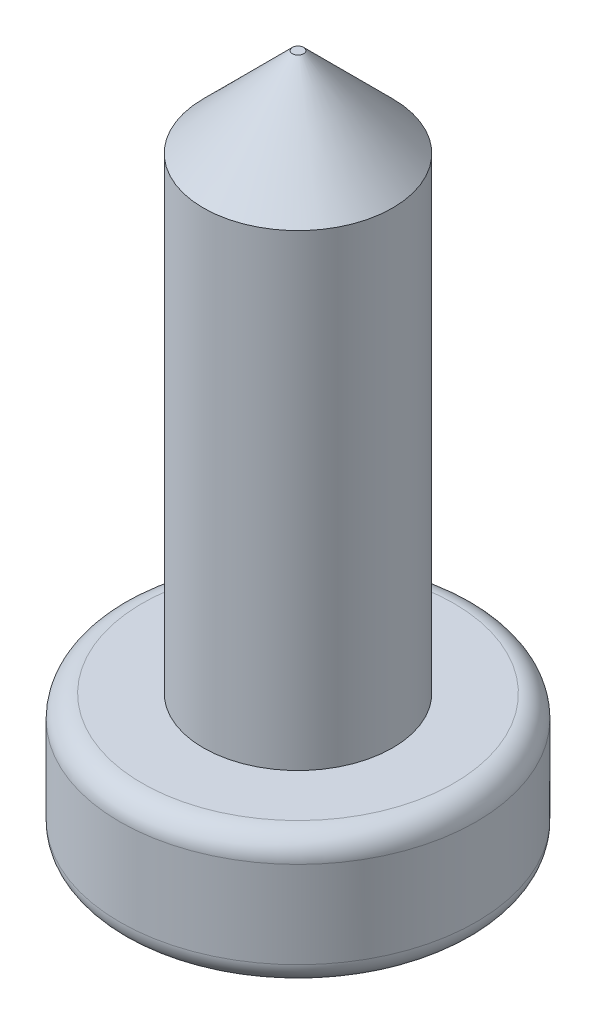
ISO-10303-21;
HEADER;
FILE_DESCRIPTION(('STEP AP214'),'2;1');
FILE_NAME('part.step','',(''),(''),'','','');
FILE_SCHEMA(('AUTOMOTIVE_DESIGN { 1 0 10303 214 1 1 1 1 }'));
ENDSEC;
DATA;
#1=APPLICATION_CONTEXT('core data for automotive mechanical design processes');
#2=APPLICATION_PROTOCOL_DEFINITION('international standard','automotive_design',2000,#1);
#3=PRODUCT_CONTEXT('',#1,'mechanical');
#4=PRODUCT('Part','Part','',(#3));
#5=PRODUCT_RELATED_PRODUCT_CATEGORY('part','',(#4));
#6=PRODUCT_DEFINITION_FORMATION('','',#4);
#7=PRODUCT_DEFINITION_CONTEXT('part definition',#1,'design');
#8=PRODUCT_DEFINITION('design','',#6,#7);
#9=PRODUCT_DEFINITION_SHAPE('','',#8);
#10=(LENGTH_UNIT() NAMED_UNIT(*) SI_UNIT(.MILLI.,.METRE.));
#11=(NAMED_UNIT(*) PLANE_ANGLE_UNIT() SI_UNIT($,.RADIAN.));
#12=(NAMED_UNIT(*) SI_UNIT($,.STERADIAN.) SOLID_ANGLE_UNIT());
#13=UNCERTAINTY_MEASURE_WITH_UNIT(LENGTH_MEASURE(1.E-05),#10,'distance_accuracy_value','');
#14=(GEOMETRIC_REPRESENTATION_CONTEXT(3) GLOBAL_UNCERTAINTY_ASSIGNED_CONTEXT((#13)) GLOBAL_UNIT_ASSIGNED_CONTEXT((#10,
#11,#12)) REPRESENTATION_CONTEXT('',''));
#15=CARTESIAN_POINT('',(0.,0.,0.));
#16=DIRECTION('',(0.,0.,1.));
#17=DIRECTION('',(1.,0.,0.));
#18=AXIS2_PLACEMENT_3D('',#15,#16,#17);
#19=CARTESIAN_POINT('',(0.,6.18,0.));
#20=DIRECTION('',(0.,-1.,0.));
#21=DIRECTION('',(0.,0.,-1.));
#22=AXIS2_PLACEMENT_3D('',#19,#20,#21);
#23=PLANE('',#22);
#24=CARTESIAN_POINT('',(0.,6.18,0.));
#25=DIRECTION('',(0.,-1.,0.));
#26=DIRECTION('',(0.,0.,-1.));
#27=AXIS2_PLACEMENT_3D('',#24,#25,#26);
#28=CIRCLE('',#27,0.0500000000000007);
#29=CARTESIAN_POINT('',(0.,6.18,-0.0500000000000002));
#30=VERTEX_POINT('',#29);
#31=EDGE_CURVE('E183',#30,#30,#28,.F.);
#32=ORIENTED_EDGE('',*,*,#31,.T.);
#33=EDGE_LOOP('',(#32));
#34=FACE_BOUND('',#33,.T.);
#35=ADVANCED_FACE('F35',(#34),#23,.F.);
#36=CARTESIAN_POINT('',(0.,6.18,0.));
#37=DIRECTION('',(0.,1.,0.));
#38=DIRECTION('',(0.,0.,1.));
#39=AXIS2_PLACEMENT_3D('',#36,#37,#38);
#40=CYLINDRICAL_SURFACE('',#39,0.85);
#41=CARTESIAN_POINT('',(0.,5.38,0.));
#42=DIRECTION('',(0.,-1.,0.));
#43=DIRECTION('',(0.,0.,-1.));
#44=AXIS2_PLACEMENT_3D('',#41,#42,#43);
#45=CIRCLE('',#44,0.85);
#46=CARTESIAN_POINT('',(0.,5.38,-0.85));
#47=VERTEX_POINT('',#46);
#48=EDGE_CURVE('E186',#47,#47,#45,.T.);
#49=ORIENTED_EDGE('',*,*,#48,.T.);
#50=EDGE_LOOP('',(#49));
#51=FACE_BOUND('',#50,.T.);
#52=CARTESIAN_POINT('',(0.,1.18,0.));
#53=DIRECTION('',(0.,1.,0.));
#54=DIRECTION('',(0.,0.,1.));
#55=AXIS2_PLACEMENT_3D('',#52,#53,#54);
#56=CIRCLE('',#55,0.850000000000001);
#57=CARTESIAN_POINT('',(0.,1.18,0.850000000000001));
#58=VERTEX_POINT('',#57);
#59=EDGE_CURVE('E180',#58,#58,#56,.T.);
#60=ORIENTED_EDGE('',*,*,#59,.T.);
#61=EDGE_LOOP('',(#60));
#62=FACE_BOUND('',#61,.T.);
#63=ADVANCED_FACE('F209',(#51,#62),#40,.T.);
#64=CARTESIAN_POINT('',(1.6,1.18,0.));
#65=DIRECTION('',(0.,-1.,0.));
#66=DIRECTION('',(0.,0.,-1.));
#67=AXIS2_PLACEMENT_3D('',#64,#65,#66);
#68=PLANE('',#67);
#69=CARTESIAN_POINT('',(0.,1.18,0.));
#70=DIRECTION('',(0.,-1.,0.));
#71=DIRECTION('',(0.,0.,-1.));
#72=AXIS2_PLACEMENT_3D('',#69,#70,#71);
#73=CIRCLE('',#72,1.4);
#74=CARTESIAN_POINT('',(0.,1.18,-1.4));
#75=VERTEX_POINT('',#74);
#76=EDGE_CURVE('E189',#75,#75,#73,.F.);
#77=ORIENTED_EDGE('',*,*,#76,.T.);
#78=EDGE_LOOP('',(#77));
#79=FACE_BOUND('',#78,.T.);
#80=ORIENTED_EDGE('',*,*,#59,.F.);
#81=EDGE_LOOP('',(#80));
#82=FACE_BOUND('',#81,.T.);
#83=ADVANCED_FACE('F206',(#79,#82),#68,.F.);
#84=CARTESIAN_POINT('',(0.,6.18,0.));
#85=DIRECTION('',(0.,1.,0.));
#86=DIRECTION('',(0.,0.,1.));
#87=AXIS2_PLACEMENT_3D('',#84,#85,#86);
#88=CYLINDRICAL_SURFACE('',#87,1.6);
#89=CARTESIAN_POINT('',(0.,0.98,0.));
#90=DIRECTION('',(0.,-1.,0.));
#91=DIRECTION('',(0.,0.,-1.));
#92=AXIS2_PLACEMENT_3D('',#89,#90,#91);
#93=CIRCLE('',#92,1.6);
#94=CARTESIAN_POINT('',(0.,0.98,-1.6));
#95=VERTEX_POINT('',#94);
#96=EDGE_CURVE('E43',#95,#95,#93,.T.);
#97=ORIENTED_EDGE('',*,*,#96,.T.);
#98=EDGE_LOOP('',(#97));
#99=FACE_BOUND('',#98,.T.);
#100=CARTESIAN_POINT('',(0.,0.2,0.));
#101=DIRECTION('',(0.,1.,0.));
#102=DIRECTION('',(0.,0.,1.));
#103=AXIS2_PLACEMENT_3D('',#100,#101,#102);
#104=CIRCLE('',#103,1.6);
#105=CARTESIAN_POINT('',(0.,0.2,1.6));
#106=VERTEX_POINT('',#105);
#107=EDGE_CURVE('E192',#106,#106,#104,.T.);
#108=ORIENTED_EDGE('',*,*,#107,.T.);
#109=EDGE_LOOP('',(#108));
#110=FACE_BOUND('',#109,.T.);
#111=ADVANCED_FACE('F197',(#99,#110),#88,.T.);
#112=CARTESIAN_POINT('',(0.,0.,0.));
#113=DIRECTION('',(0.,1.,0.));
#114=DIRECTION('',(0.,0.,1.));
#115=AXIS2_PLACEMENT_3D('',#112,#113,#114);
#116=PLANE('',#115);
#117=DIRECTION('',(1.,0.,0.));
#118=VECTOR('',#117,1.);
#119=CARTESIAN_POINT('',(0.25,0.,-0.249999999999999));
#120=LINE('',#119,#118);
#121=CARTESIAN_POINT('',(0.25,0.,-0.249999999999999));
#122=VERTEX_POINT('',#121);
#123=CARTESIAN_POINT('',(1.,0.,-0.249999999999995));
#124=VERTEX_POINT('',#123);
#125=EDGE_CURVE('E114',#122,#124,#120,.T.);
#126=ORIENTED_EDGE('',*,*,#125,.F.);
#127=DIRECTION('',(0.,0.,1.));
#128=VECTOR('',#127,1.);
#129=CARTESIAN_POINT('',(0.25,0.,-0.249999999999999));
#130=LINE('',#129,#128);
#131=CARTESIAN_POINT('',(0.25,0.,-1.));
#132=VERTEX_POINT('',#131);
#133=EDGE_CURVE('E50',#132,#122,#130,.T.);
#134=ORIENTED_EDGE('',*,*,#133,.F.);
#135=DIRECTION('',(1.,0.,0.));
#136=VECTOR('',#135,1.);
#137=CARTESIAN_POINT('',(-0.25,0.,-1.));
#138=LINE('',#137,#136);
#139=CARTESIAN_POINT('',(-0.25,0.,-1.));
#140=VERTEX_POINT('',#139);
#141=EDGE_CURVE('E148',#140,#132,#138,.T.);
#142=ORIENTED_EDGE('',*,*,#141,.F.);
#143=DIRECTION('',(0.,0.,-1.));
#144=VECTOR('',#143,1.);
#145=CARTESIAN_POINT('',(-0.25,0.,-0.250000000000002));
#146=LINE('',#145,#144);
#147=CARTESIAN_POINT('',(-0.25,0.,-0.250000000000002));
#148=VERTEX_POINT('',#147);
#149=EDGE_CURVE('E145',#148,#140,#146,.T.);
#150=ORIENTED_EDGE('',*,*,#149,.F.);
#151=DIRECTION('',(1.,0.,0.));
#152=VECTOR('',#151,1.);
#153=CARTESIAN_POINT('',(-0.999999999999996,0.,-0.250000000000006));
#154=LINE('',#153,#152);
#155=CARTESIAN_POINT('',(-0.999999999999996,0.,-0.250000000000006));
#156=VERTEX_POINT('',#155);
#157=EDGE_CURVE('E142',#156,#148,#154,.T.);
#158=ORIENTED_EDGE('',*,*,#157,.F.);
#159=DIRECTION('',(0.,0.,-1.));
#160=VECTOR('',#159,1.);
#161=CARTESIAN_POINT('',(-0.999999999999996,0.,-0.250000000000006));
#162=LINE('',#161,#160);
#163=CARTESIAN_POINT('',(-1.,0.,0.249999999999994));
#164=VERTEX_POINT('',#163);
#165=EDGE_CURVE('E139',#164,#156,#162,.T.);
#166=ORIENTED_EDGE('',*,*,#165,.F.);
#167=DIRECTION('',(-1.,0.,0.));
#168=VECTOR('',#167,1.);
#169=CARTESIAN_POINT('',(-1.,0.,0.249999999999994));
#170=LINE('',#169,#168);
#171=CARTESIAN_POINT('',(-0.250000000000001,0.,0.249999999999998));
#172=VERTEX_POINT('',#171);
#173=EDGE_CURVE('E136',#172,#164,#170,.T.);
#174=ORIENTED_EDGE('',*,*,#173,.F.);
#175=DIRECTION('',(0.,0.,-1.));
#176=VECTOR('',#175,1.);
#177=CARTESIAN_POINT('',(-0.25,0.,1.));
#178=LINE('',#177,#176);
#179=CARTESIAN_POINT('',(-0.25,0.,1.));
#180=VERTEX_POINT('',#179);
#181=EDGE_CURVE('E133',#180,#172,#178,.T.);
#182=ORIENTED_EDGE('',*,*,#181,.F.);
#183=DIRECTION('',(-1.,0.,0.));
#184=VECTOR('',#183,1.);
#185=CARTESIAN_POINT('',(-0.25,0.,1.));
#186=LINE('',#185,#184);
#187=CARTESIAN_POINT('',(0.25,0.,1.));
#188=VERTEX_POINT('',#187);
#189=EDGE_CURVE('E130',#188,#180,#186,.T.);
#190=ORIENTED_EDGE('',*,*,#189,.F.);
#191=DIRECTION('',(0.,0.,1.));
#192=VECTOR('',#191,1.);
#193=CARTESIAN_POINT('',(0.25,0.,1.));
#194=LINE('',#193,#192);
#195=CARTESIAN_POINT('',(0.25,0.,0.250000000000001));
#196=VERTEX_POINT('',#195);
#197=EDGE_CURVE('E124',#196,#188,#194,.T.);
#198=ORIENTED_EDGE('',*,*,#197,.F.);
#199=DIRECTION('',(-1.,0.,0.));
#200=VECTOR('',#199,1.);
#201=CARTESIAN_POINT('',(0.25,0.,0.250000000000001));
#202=LINE('',#201,#200);
#203=CARTESIAN_POINT('',(1.,0.,0.250000000000006));
#204=VERTEX_POINT('',#203);
#205=EDGE_CURVE('E122',#204,#196,#202,.T.);
#206=ORIENTED_EDGE('',*,*,#205,.F.);
#207=DIRECTION('',(0.,0.,1.));
#208=VECTOR('',#207,1.);
#209=CARTESIAN_POINT('',(1.,0.,-0.249999999999995));
#210=LINE('',#209,#208);
#211=EDGE_CURVE('E108',#124,#204,#210,.T.);
#212=ORIENTED_EDGE('',*,*,#211,.F.);
#213=EDGE_LOOP('',(#126,#134,#142,#150,#158,#166,#174,#182,#190,#198,#206,#212));
#214=FACE_BOUND('',#213,.T.);
#215=CARTESIAN_POINT('',(0.,0.,0.));
#216=DIRECTION('',(0.,1.,0.));
#217=DIRECTION('',(0.,0.,1.));
#218=AXIS2_PLACEMENT_3D('',#215,#216,#217);
#219=CIRCLE('',#218,1.4);
#220=CARTESIAN_POINT('',(0.,0.,1.4));
#221=VERTEX_POINT('',#220);
#222=EDGE_CURVE('E11',#221,#221,#219,.F.);
#223=ORIENTED_EDGE('',*,*,#222,.T.);
#224=EDGE_LOOP('',(#223));
#225=FACE_BOUND('',#224,.T.);
#226=ADVANCED_FACE('F118',(#214,#225),#116,.F.);
#227=CARTESIAN_POINT('',(0.,6.18,0.));
#228=DIRECTION('',(0.,-1.,0.));
#229=DIRECTION('',(0.,0.,-1.));
#230=AXIS2_PLACEMENT_3D('',#227,#228,#229);
#231=CONICAL_SURFACE('',#230,0.0500000000000007,0.785398163397447);
#232=CARTESIAN_POINT('',(0.,5.38,-0.85));
#233=CARTESIAN_POINT('',(0.,5.38833333333333,-0.841666666666667));
#234=CARTESIAN_POINT('',(0.,5.39666666666666,-0.833333333333333));
#235=CARTESIAN_POINT('',(0.,5.41333333333333,-0.816666666666667));
#236=CARTESIAN_POINT('',(0.,5.42166666666667,-0.808333333333333));
#237=CARTESIAN_POINT('',(0.,5.43833333333333,-0.791666666666666));
#238=CARTESIAN_POINT('',(0.,5.44666666666666,-0.783333333333333));
#239=CARTESIAN_POINT('',(0.,5.46333333333333,-0.766666666666666));
#240=CARTESIAN_POINT('',(0.,5.47166666666667,-0.758333333333333));
#241=CARTESIAN_POINT('',(0.,5.48833333333333,-0.741666666666667));
#242=CARTESIAN_POINT('',(0.,5.49666666666667,-0.733333333333333));
#243=CARTESIAN_POINT('',(0.,5.51333333333333,-0.716666666666667));
#244=CARTESIAN_POINT('',(0.,5.52166666666667,-0.708333333333333));
#245=CARTESIAN_POINT('',(0.,5.53833333333333,-0.691666666666667));
#246=CARTESIAN_POINT('',(0.,5.54666666666667,-0.683333333333333));
#247=CARTESIAN_POINT('',(0.,5.56333333333333,-0.666666666666667));
#248=CARTESIAN_POINT('',(0.,5.57166666666666,-0.658333333333333));
#249=CARTESIAN_POINT('',(0.,5.58833333333333,-0.641666666666667));
#250=CARTESIAN_POINT('',(0.,5.59666666666667,-0.633333333333333));
#251=CARTESIAN_POINT('',(0.,5.61333333333333,-0.616666666666667));
#252=CARTESIAN_POINT('',(0.,5.62166666666667,-0.608333333333333));
#253=CARTESIAN_POINT('',(0.,5.63833333333333,-0.591666666666667));
#254=CARTESIAN_POINT('',(0.,5.64666666666667,-0.583333333333333));
#255=CARTESIAN_POINT('',(0.,5.66333333333333,-0.566666666666667));
#256=CARTESIAN_POINT('',(0.,5.67166666666667,-0.558333333333333));
#257=CARTESIAN_POINT('',(0.,5.68833333333333,-0.541666666666667));
#258=CARTESIAN_POINT('',(0.,5.69666666666667,-0.533333333333333));
#259=CARTESIAN_POINT('',(0.,5.71333333333333,-0.516666666666667));
#260=CARTESIAN_POINT('',(0.,5.72166666666667,-0.508333333333333));
#261=CARTESIAN_POINT('',(0.,5.73833333333333,-0.491666666666667));
#262=CARTESIAN_POINT('',(0.,5.74666666666667,-0.483333333333333));
#263=CARTESIAN_POINT('',(0.,5.76333333333333,-0.466666666666667));
#264=CARTESIAN_POINT('',(0.,5.77166666666667,-0.458333333333333));
#265=CARTESIAN_POINT('',(0.,5.78833333333333,-0.441666666666667));
#266=CARTESIAN_POINT('',(0.,5.79666666666667,-0.433333333333333));
#267=CARTESIAN_POINT('',(0.,5.81333333333333,-0.416666666666667));
#268=CARTESIAN_POINT('',(0.,5.82166666666667,-0.408333333333333));
#269=CARTESIAN_POINT('',(0.,5.83833333333333,-0.391666666666667));
#270=CARTESIAN_POINT('',(0.,5.84666666666667,-0.383333333333333));
#271=CARTESIAN_POINT('',(0.,5.86333333333333,-0.366666666666667));
#272=CARTESIAN_POINT('',(0.,5.87166666666667,-0.358333333333334));
#273=CARTESIAN_POINT('',(0.,5.88833333333333,-0.341666666666667));
#274=CARTESIAN_POINT('',(0.,5.89666666666667,-0.333333333333333));
#275=CARTESIAN_POINT('',(0.,5.91333333333333,-0.316666666666667));
#276=CARTESIAN_POINT('',(0.,5.92166666666667,-0.308333333333333));
#277=CARTESIAN_POINT('',(0.,5.93833333333333,-0.291666666666667));
#278=CARTESIAN_POINT('',(0.,5.94666666666667,-0.283333333333333));
#279=CARTESIAN_POINT('',(0.,5.96333333333333,-0.266666666666667));
#280=CARTESIAN_POINT('',(0.,5.97166666666667,-0.258333333333333));
#281=CARTESIAN_POINT('',(0.,5.98833333333333,-0.241666666666667));
#282=CARTESIAN_POINT('',(0.,5.99666666666667,-0.233333333333334));
#283=CARTESIAN_POINT('',(0.,6.01333333333333,-0.216666666666667));
#284=CARTESIAN_POINT('',(0.,6.02166666666667,-0.208333333333334));
#285=CARTESIAN_POINT('',(0.,6.03833333333333,-0.191666666666667));
#286=CARTESIAN_POINT('',(0.,6.04666666666667,-0.183333333333333));
#287=CARTESIAN_POINT('',(0.,6.06333333333333,-0.166666666666667));
#288=CARTESIAN_POINT('',(0.,6.07166666666667,-0.158333333333334));
#289=CARTESIAN_POINT('',(0.,6.08833333333333,-0.141666666666667));
#290=CARTESIAN_POINT('',(0.,6.09666666666667,-0.133333333333334));
#291=CARTESIAN_POINT('',(0.,6.11333333333333,-0.116666666666667));
#292=CARTESIAN_POINT('',(0.,6.12166666666667,-0.108333333333334));
#293=CARTESIAN_POINT('',(0.,6.13833333333333,-0.0916666666666669));
#294=CARTESIAN_POINT('',(0.,6.14666666666667,-0.0833333333333336));
#295=CARTESIAN_POINT('',(0.,6.16333333333333,-0.0666666666666669));
#296=CARTESIAN_POINT('',(0.,6.17166666666667,-0.0583333333333336));
#297=CARTESIAN_POINT('',(0.,6.18,-0.0500000000000002));
#298=B_SPLINE_CURVE_WITH_KNOTS('',3,(#232,#233,#234,#235,#236,#237,#238,#239,#240,#241,#242,
#243,#244,#245,#246,#247,#248,#249,#250,#251,#252,#253,#254,#255,#256,#257,#258,#259,#260,#261,
#262,#263,#264,#265,#266,#267,#268,#269,#270,#271,#272,#273,#274,#275,#276,#277,#278,#279,#280,
#281,#282,#283,#284,#285,#286,#287,#288,#289,#290,#291,#292,#293,#294,#295,#296,#297),
.UNSPECIFIED.,.F.,.F.,(4,2,2,2,2,2,2,2,2,2,2,2,2,2,2,2,2,2,2,2,2,2,2,2,2,2,2,2,2,2,2,2,4),(0.,
0.0353553390593279,0.0707106781186552,0.106066017177982,0.14142135623731,0.176776695296638,
0.212132034355965,0.247487373415292,0.282842712474619,0.318198051533947,0.353553390593275,
0.388908729652602,0.42426406871193,0.459619407771257,0.494974746830584,0.530330085889911,
0.565685424949239,0.601040764008567,0.636396103067894,0.671751442127221,0.707106781186549,
0.742462120245876,0.777817459305203,0.813172798364531,0.848528137423858,0.883883476483186,
0.919238815542513,0.95459415460184,0.989949493661168,1.0253048327205,1.06066017177982,
1.09601551083915,1.13137084989848),.UNSPECIFIED.);
#299=EDGE_CURVE('BSEAM203',#47,#30,#298,.T.);
#300=ORIENTED_EDGE('',*,*,#48,.F.);
#301=ORIENTED_EDGE('',*,*,#31,.F.);
#302=ORIENTED_EDGE('',*,*,#299,.T.);
#303=ORIENTED_EDGE('',*,*,#299,.F.);
#304=EDGE_LOOP('',(#300,#302,#301,#303));
#305=FACE_BOUND('',#304,.T.);
#306=ADVANCED_FACE('F203',(#305),#231,.T.);
#307=CARTESIAN_POINT('',(0.,0.98,0.));
#308=DIRECTION('',(0.,-1.,0.));
#309=DIRECTION('',(0.,0.,-1.));
#310=AXIS2_PLACEMENT_3D('',#307,#308,#309);
#311=TOROIDAL_SURFACE('',#310,1.4,0.2);
#312=ORIENTED_EDGE('',*,*,#96,.F.);
#313=EDGE_LOOP('',(#312));
#314=FACE_BOUND('',#313,.T.);
#315=ORIENTED_EDGE('',*,*,#76,.F.);
#316=EDGE_LOOP('',(#315));
#317=FACE_BOUND('',#316,.T.);
#318=ADVANCED_FACE('F200',(#314,#317),#311,.T.);
#319=CARTESIAN_POINT('',(0.,0.2,0.));
#320=DIRECTION('',(0.,1.,0.));
#321=DIRECTION('',(0.,0.,1.));
#322=AXIS2_PLACEMENT_3D('',#319,#320,#321);
#323=TOROIDAL_SURFACE('',#322,1.4,0.2);
#324=ORIENTED_EDGE('',*,*,#222,.F.);
#325=EDGE_LOOP('',(#324));
#326=FACE_BOUND('',#325,.T.);
#327=ORIENTED_EDGE('',*,*,#107,.F.);
#328=EDGE_LOOP('',(#327));
#329=FACE_BOUND('',#328,.T.);
#330=ADVANCED_FACE('F37',(#326,#329),#323,.T.);
#331=CARTESIAN_POINT('',(0.25,0.,-0.249999999999999));
#332=DIRECTION('',(0.970295726275996,0.241921895599668,0.));
#333=DIRECTION('',(-0.241921895599668,0.970295726275996,0.));
#334=AXIS2_PLACEMENT_3D('',#331,#332,#333);
#335=PLANE('',#334);
#336=DIRECTION('',(0.235138839312811,-0.943090373449569,-0.235138839312811));
#337=VECTOR('',#336,1.);
#338=CARTESIAN_POINT('',(0.222354863123312,0.110878587890009,-0.972354863123312));
#339=LINE('',#338,#337);
#340=CARTESIAN_POINT('',(0.,1.00269523338396,-0.75));
#341=VERTEX_POINT('',#340);
#342=EDGE_CURVE('E151',#341,#132,#339,.T.);
#343=ORIENTED_EDGE('',*,*,#342,.T.);
#344=ORIENTED_EDGE('',*,*,#133,.T.);
#345=DIRECTION('',(0.235138839312811,-0.943090373449569,-0.23513883931281));
#346=VECTOR('',#345,1.);
#347=CARTESIAN_POINT('',(0.25,0.,-0.249999999999999));
#348=LINE('',#347,#346);
#349=CARTESIAN_POINT('',(0.,1.00269523338396,0.));
#350=VERTEX_POINT('',#349);
#351=EDGE_CURVE('E111',#350,#122,#348,.T.);
#352=ORIENTED_EDGE('',*,*,#351,.F.);
#353=DIRECTION('',(0.,0.,1.));
#354=VECTOR('',#353,1.);
#355=CARTESIAN_POINT('',(0.,1.00269523338396,-0.249999999999999));
#356=LINE('',#355,#354);
#357=EDGE_CURVE('E153',#341,#350,#356,.T.);
#358=ORIENTED_EDGE('',*,*,#357,.F.);
#359=EDGE_LOOP('',(#343,#344,#352,#358));
#360=FACE_BOUND('',#359,.T.);
#361=ADVANCED_FACE('F246',(#360),#335,.F.);
#362=CARTESIAN_POINT('',(-0.25,0.,-1.));
#363=DIRECTION('',(0.,0.241921895599668,-0.970295726275996));
#364=DIRECTION('',(0.,0.970295726275996,0.241921895599668));
#365=AXIS2_PLACEMENT_3D('',#362,#363,#364);
#366=PLANE('',#365);
#367=ORIENTED_EDGE('',*,*,#141,.T.);
#368=ORIENTED_EDGE('',*,*,#342,.F.);
#369=DIRECTION('',(-0.235138839312811,-0.943090373449569,-0.235138839312811));
#370=VECTOR('',#369,1.);
#371=CARTESIAN_POINT('',(-0.208532294684968,0.166317881835013,-0.958532294684968));
#372=LINE('',#371,#370);
#373=EDGE_CURVE('E154',#341,#140,#372,.T.);
#374=ORIENTED_EDGE('',*,*,#373,.T.);
#375=EDGE_LOOP('',(#367,#368,#374));
#376=FACE_BOUND('',#375,.T.);
#377=ADVANCED_FACE('F242',(#376),#366,.F.);
#378=CARTESIAN_POINT('',(-0.25,0.,-0.250000000000002));
#379=DIRECTION('',(-0.970295726275996,0.241921895599668,0.));
#380=DIRECTION('',(-0.241921895599668,-0.970295726275996,0.));
#381=AXIS2_PLACEMENT_3D('',#378,#379,#380);
#382=PLANE('',#381);
#383=ORIENTED_EDGE('',*,*,#357,.T.);
#384=DIRECTION('',(-0.235138839312811,-0.943090373449569,-0.235138839312812));
#385=VECTOR('',#384,1.);
#386=CARTESIAN_POINT('',(-0.25,0.,-0.250000000000002));
#387=LINE('',#386,#385);
#388=EDGE_CURVE('E169',#350,#148,#387,.T.);
#389=ORIENTED_EDGE('',*,*,#388,.T.);
#390=ORIENTED_EDGE('',*,*,#149,.T.);
#391=ORIENTED_EDGE('',*,*,#373,.F.);
#392=EDGE_LOOP('',(#383,#389,#390,#391));
#393=FACE_BOUND('',#392,.T.);
#394=ADVANCED_FACE('F245',(#393),#382,.F.);
#395=CARTESIAN_POINT('',(-0.999999999999996,0.,-0.250000000000006));
#396=DIRECTION('',(0.,0.241921895599668,-0.970295726275996));
#397=DIRECTION('',(0.,0.970295726275996,0.241921895599668));
#398=AXIS2_PLACEMENT_3D('',#395,#396,#397);
#399=PLANE('',#398);
#400=DIRECTION('',(-0.235138839312809,-0.943090373449569,-0.235138839312812));
#401=VECTOR('',#400,1.);
#402=CARTESIAN_POINT('',(-0.999999999999996,0.,-0.250000000000006));
#403=LINE('',#402,#401);
#404=CARTESIAN_POINT('',(-0.749999999999998,1.00269523338396,0.));
#405=VERTEX_POINT('',#404);
#406=EDGE_CURVE('E167',#405,#156,#403,.T.);
#407=ORIENTED_EDGE('',*,*,#406,.T.);
#408=ORIENTED_EDGE('',*,*,#157,.T.);
#409=ORIENTED_EDGE('',*,*,#388,.F.);
#410=DIRECTION('',(1.,0.,0.));
#411=VECTOR('',#410,1.);
#412=CARTESIAN_POINT('',(-0.999999999999998,1.00269523338396,0.));
#413=LINE('',#412,#411);
#414=EDGE_CURVE('E174',#405,#350,#413,.T.);
#415=ORIENTED_EDGE('',*,*,#414,.F.);
#416=EDGE_LOOP('',(#407,#408,#409,#415));
#417=FACE_BOUND('',#416,.T.);
#418=ADVANCED_FACE('F250',(#417),#399,.F.);
#419=CARTESIAN_POINT('',(-0.999999999999996,0.,-0.250000000000006));
#420=DIRECTION('',(-0.970295726275996,0.241921895599668,0.));
#421=DIRECTION('',(-0.241921895599668,-0.970295726275996,0.));
#422=AXIS2_PLACEMENT_3D('',#419,#420,#421);
#423=PLANE('',#422);
#424=ORIENTED_EDGE('',*,*,#165,.T.);
#425=ORIENTED_EDGE('',*,*,#406,.F.);
#426=DIRECTION('',(-0.235138839312813,-0.943090373449569,0.23513883931281));
#427=VECTOR('',#426,1.);
#428=CARTESIAN_POINT('',(-1.,0.,0.249999999999994));
#429=LINE('',#428,#427);
#430=EDGE_CURVE('E165',#405,#164,#429,.T.);
#431=ORIENTED_EDGE('',*,*,#430,.T.);
#432=EDGE_LOOP('',(#424,#425,#431));
#433=FACE_BOUND('',#432,.T.);
#434=ADVANCED_FACE('F254',(#433),#423,.F.);
#435=CARTESIAN_POINT('',(-1.,0.,0.249999999999994));
#436=DIRECTION('',(0.,0.241921895599668,0.970295726275996));
#437=DIRECTION('',(0.,-0.970295726275996,0.241921895599668));
#438=AXIS2_PLACEMENT_3D('',#435,#436,#437);
#439=PLANE('',#438);
#440=ORIENTED_EDGE('',*,*,#414,.T.);
#441=DIRECTION('',(-0.235138839312811,-0.94309037344957,0.23513883931281));
#442=VECTOR('',#441,1.);
#443=CARTESIAN_POINT('',(-0.291467705315032,-0.166317881835012,0.29146770531503));
#444=LINE('',#443,#442);
#445=EDGE_CURVE('E163',#350,#172,#444,.T.);
#446=ORIENTED_EDGE('',*,*,#445,.T.);
#447=ORIENTED_EDGE('',*,*,#173,.T.);
#448=ORIENTED_EDGE('',*,*,#430,.F.);
#449=EDGE_LOOP('',(#440,#446,#447,#448));
#450=FACE_BOUND('',#449,.T.);
#451=ADVANCED_FACE('F258',(#450),#439,.F.);
#452=CARTESIAN_POINT('',(-0.25,0.,1.));
#453=DIRECTION('',(-0.970295726275996,0.241921895599668,0.));
#454=DIRECTION('',(-0.241921895599668,-0.970295726275996,0.));
#455=AXIS2_PLACEMENT_3D('',#452,#453,#454);
#456=PLANE('',#455);
#457=DIRECTION('',(-0.235138839312811,-0.943090373449569,0.235138839312811));
#458=VECTOR('',#457,1.);
#459=CARTESIAN_POINT('',(-0.25,0.,1.));
#460=LINE('',#459,#458);
#461=CARTESIAN_POINT('',(0.,1.00269523338396,0.75));
#462=VERTEX_POINT('',#461);
#463=EDGE_CURVE('E161',#462,#180,#460,.T.);
#464=ORIENTED_EDGE('',*,*,#463,.T.);
#465=ORIENTED_EDGE('',*,*,#181,.T.);
#466=ORIENTED_EDGE('',*,*,#445,.F.);
#467=DIRECTION('',(0.,0.,-1.));
#468=VECTOR('',#467,1.);
#469=CARTESIAN_POINT('',(0.,1.00269523338396,1.));
#470=LINE('',#469,#468);
#471=EDGE_CURVE('E177',#462,#350,#470,.T.);
#472=ORIENTED_EDGE('',*,*,#471,.F.);
#473=EDGE_LOOP('',(#464,#465,#466,#472));
#474=FACE_BOUND('',#473,.T.);
#475=ADVANCED_FACE('F262',(#474),#456,.F.);
#476=CARTESIAN_POINT('',(-0.25,0.,1.));
#477=DIRECTION('',(0.,0.241921895599668,0.970295726275996));
#478=DIRECTION('',(0.,-0.970295726275996,0.241921895599668));
#479=AXIS2_PLACEMENT_3D('',#476,#477,#478);
#480=PLANE('',#479);
#481=ORIENTED_EDGE('',*,*,#189,.T.);
#482=ORIENTED_EDGE('',*,*,#463,.F.);
#483=DIRECTION('',(0.235138839312811,-0.943090373449569,0.235138839312811));
#484=VECTOR('',#483,1.);
#485=CARTESIAN_POINT('',(0.25,0.,1.));
#486=LINE('',#485,#484);
#487=EDGE_CURVE('E159',#462,#188,#486,.T.);
#488=ORIENTED_EDGE('',*,*,#487,.T.);
#489=EDGE_LOOP('',(#481,#482,#488));
#490=FACE_BOUND('',#489,.T.);
#491=ADVANCED_FACE('F266',(#490),#480,.F.);
#492=CARTESIAN_POINT('',(0.25,0.,1.));
#493=DIRECTION('',(0.970295726275996,0.241921895599668,0.));
#494=DIRECTION('',(-0.241921895599668,0.970295726275996,0.));
#495=AXIS2_PLACEMENT_3D('',#492,#493,#494);
#496=PLANE('',#495);
#497=ORIENTED_EDGE('',*,*,#471,.T.);
#498=DIRECTION('',(0.235138839312811,-0.943090373449569,0.235138839312812));
#499=VECTOR('',#498,1.);
#500=CARTESIAN_POINT('',(0.291467705315032,-0.166317881835014,0.291467705315034));
#501=LINE('',#500,#499);
#502=EDGE_CURVE('E157',#350,#196,#501,.T.);
#503=ORIENTED_EDGE('',*,*,#502,.T.);
#504=ORIENTED_EDGE('',*,*,#197,.T.);
#505=ORIENTED_EDGE('',*,*,#487,.F.);
#506=EDGE_LOOP('',(#497,#503,#504,#505));
#507=FACE_BOUND('',#506,.T.);
#508=ADVANCED_FACE('F270',(#507),#496,.F.);
#509=CARTESIAN_POINT('',(0.25,0.,0.250000000000001));
#510=DIRECTION('',(0.,0.241921895599668,0.970295726275996));
#511=DIRECTION('',(0.,-0.970295726275996,0.241921895599668));
#512=AXIS2_PLACEMENT_3D('',#509,#510,#511);
#513=PLANE('',#512);
#514=DIRECTION('',(0.23513883931281,-0.943090373449569,0.235138839312812));
#515=VECTOR('',#514,1.);
#516=CARTESIAN_POINT('',(0.972354863123313,0.110878587890009,0.222354863123317));
#517=LINE('',#516,#515);
#518=CARTESIAN_POINT('',(0.750000000000002,1.00269523338396,0.));
#519=VERTEX_POINT('',#518);
#520=EDGE_CURVE('E110',#519,#204,#517,.T.);
#521=ORIENTED_EDGE('',*,*,#520,.T.);
#522=ORIENTED_EDGE('',*,*,#205,.T.);
#523=ORIENTED_EDGE('',*,*,#502,.F.);
#524=DIRECTION('',(-1.,0.,0.));
#525=VECTOR('',#524,1.);
#526=CARTESIAN_POINT('',(0.250000000000001,1.00269523338396,0.));
#527=LINE('',#526,#525);
#528=EDGE_CURVE('E57',#519,#350,#527,.T.);
#529=ORIENTED_EDGE('',*,*,#528,.F.);
#530=EDGE_LOOP('',(#521,#522,#523,#529));
#531=FACE_BOUND('',#530,.T.);
#532=ADVANCED_FACE('F274',(#531),#513,.F.);
#533=CARTESIAN_POINT('',(1.,0.,-0.249999999999995));
#534=DIRECTION('',(0.970295726275996,0.241921895599668,0.));
#535=DIRECTION('',(-0.241921895599668,0.970295726275996,0.));
#536=AXIS2_PLACEMENT_3D('',#533,#534,#535);
#537=PLANE('',#536);
#538=ORIENTED_EDGE('',*,*,#211,.T.);
#539=ORIENTED_EDGE('',*,*,#520,.F.);
#540=DIRECTION('',(0.235138839312812,-0.943090373449569,-0.23513883931281));
#541=VECTOR('',#540,1.);
#542=CARTESIAN_POINT('',(0.958532294684971,0.166317881835014,-0.208532294684963));
#543=LINE('',#542,#541);
#544=EDGE_CURVE('E104',#519,#124,#543,.T.);
#545=ORIENTED_EDGE('',*,*,#544,.T.);
#546=EDGE_LOOP('',(#538,#539,#545));
#547=FACE_BOUND('',#546,.T.);
#548=ADVANCED_FACE('F106',(#547),#537,.F.);
#549=CARTESIAN_POINT('',(0.25,0.,-0.249999999999999));
#550=DIRECTION('',(0.,0.241921895599668,-0.970295726275996));
#551=DIRECTION('',(0.,0.970295726275996,0.241921895599668));
#552=AXIS2_PLACEMENT_3D('',#549,#550,#551);
#553=PLANE('',#552);
#554=ORIENTED_EDGE('',*,*,#528,.T.);
#555=ORIENTED_EDGE('',*,*,#351,.T.);
#556=ORIENTED_EDGE('',*,*,#125,.T.);
#557=ORIENTED_EDGE('',*,*,#544,.F.);
#558=EDGE_LOOP('',(#554,#555,#556,#557));
#559=FACE_BOUND('',#558,.T.);
#560=ADVANCED_FACE('F115',(#559),#553,.F.);
#561=CLOSED_SHELL('',(#35,#63,#83,#111,#226,#306,#318,#330,#361,#377,#394,#418,#434,#451,#475,
#491,#508,#532,#548,#560));
#562=MANIFOLD_SOLID_BREP('B2',#561);
#563=ADVANCED_BREP_SHAPE_REPRESENTATION('',(#18,#562),#14);
#564=SHAPE_DEFINITION_REPRESENTATION(#9,#563);
ENDSEC;
END-ISO-10303-21;
